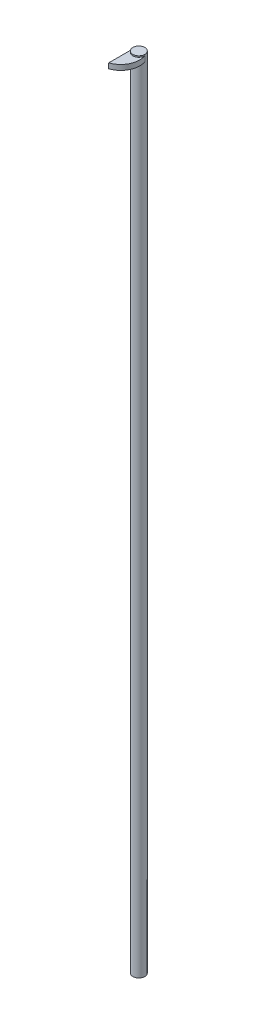
ISO-10303-21;
HEADER;
FILE_DESCRIPTION(('STEP AP214'),'2;1');
FILE_NAME('part.step','',(''),(''),'','','');
FILE_SCHEMA(('AUTOMOTIVE_DESIGN { 1 0 10303 214 1 1 1 1 }'));
ENDSEC;
DATA;
#1=APPLICATION_CONTEXT('core data for automotive mechanical design processes');
#2=APPLICATION_PROTOCOL_DEFINITION('international standard','automotive_design',2000,#1);
#3=PRODUCT_CONTEXT('',#1,'mechanical');
#4=PRODUCT('Part','Part','',(#3));
#5=PRODUCT_RELATED_PRODUCT_CATEGORY('part','',(#4));
#6=PRODUCT_DEFINITION_FORMATION('','',#4);
#7=PRODUCT_DEFINITION_CONTEXT('part definition',#1,'design');
#8=PRODUCT_DEFINITION('design','',#6,#7);
#9=PRODUCT_DEFINITION_SHAPE('','',#8);
#10=(LENGTH_UNIT() NAMED_UNIT(*) SI_UNIT(.MILLI.,.METRE.));
#11=(NAMED_UNIT(*) PLANE_ANGLE_UNIT() SI_UNIT($,.RADIAN.));
#12=(NAMED_UNIT(*) SI_UNIT($,.STERADIAN.) SOLID_ANGLE_UNIT());
#13=UNCERTAINTY_MEASURE_WITH_UNIT(LENGTH_MEASURE(1.E-05),#10,'distance_accuracy_value','');
#14=(GEOMETRIC_REPRESENTATION_CONTEXT(3) GLOBAL_UNCERTAINTY_ASSIGNED_CONTEXT((#13)) GLOBAL_UNIT_ASSIGNED_CONTEXT((#10,
#11,#12)) REPRESENTATION_CONTEXT('',''));
#15=CARTESIAN_POINT('',(0.,0.,0.));
#16=DIRECTION('',(0.,0.,1.));
#17=DIRECTION('',(1.,0.,0.));
#18=AXIS2_PLACEMENT_3D('',#15,#16,#17);
#19=CARTESIAN_POINT('',(838.898443773794,3953.07725580716,1523.82012251056));
#20=DIRECTION('',(0.,1.,0.));
#21=DIRECTION('',(0.,0.,1.));
#22=AXIS2_PLACEMENT_3D('',#19,#20,#21);
#23=CYLINDRICAL_SURFACE('',#22,9.31366205789831);
#24=CARTESIAN_POINT('',(838.898443773794,3953.07725580716,1523.82012251056));
#25=DIRECTION('',(0.,1.,0.));
#26=DIRECTION('',(0.,0.,1.));
#27=AXIS2_PLACEMENT_3D('',#24,#25,#26);
#28=CIRCLE('',#27,9.31366205789831);
#29=CARTESIAN_POINT('',(838.898443773794,3953.07725580716,1533.13378456846));
#30=VERTEX_POINT('',#29);
#31=EDGE_CURVE('E75',#30,#30,#28,.T.);
#32=ORIENTED_EDGE('',*,*,#31,.T.);
#33=EDGE_LOOP('',(#32));
#34=FACE_BOUND('',#33,.T.);
#35=CARTESIAN_POINT('',(838.898443773794,5189.07725580715,1523.82012251056));
#36=DIRECTION('',(0.,1.,0.));
#37=DIRECTION('',(0.,0.,1.));
#38=AXIS2_PLACEMENT_3D('',#35,#36,#37);
#39=CIRCLE('',#38,9.31366205789831);
#40=CARTESIAN_POINT('',(838.898443773794,5189.07725580715,1533.13378456846));
#41=VERTEX_POINT('',#40);
#42=EDGE_CURVE('E66',#41,#41,#39,.T.);
#43=ORIENTED_EDGE('',*,*,#42,.F.);
#44=EDGE_LOOP('',(#43));
#45=FACE_BOUND('',#44,.T.);
#46=DIRECTION('',(0.,-1.,0.));
#47=VECTOR('',#46,1.);
#48=CARTESIAN_POINT('',(829.584781715896,5187.07725580716,1523.82012251056));
#49=LINE('',#48,#47);
#50=CARTESIAN_POINT('',(829.584781715896,5187.07725580716,1523.82012251056));
#51=VERTEX_POINT('',#50);
#52=CARTESIAN_POINT('',(829.584781715896,5179.07725580716,1523.82012251056));
#53=VERTEX_POINT('',#52);
#54=EDGE_CURVE('E50',#51,#53,#49,.T.);
#55=ORIENTED_EDGE('',*,*,#54,.F.);
#56=CARTESIAN_POINT('',(838.898443773794,5187.07725580716,1523.82012251056));
#57=DIRECTION('',(0.,-1.,0.));
#58=DIRECTION('',(0.,0.,-1.));
#59=AXIS2_PLACEMENT_3D('',#56,#57,#58);
#60=CIRCLE('',#59,9.31366205789831);
#61=CARTESIAN_POINT('',(848.212105831693,5187.07725580716,1523.82012251056));
#62=VERTEX_POINT('',#61);
#63=EDGE_CURVE('E11',#51,#62,#60,.F.);
#64=ORIENTED_EDGE('',*,*,#63,.T.);
#65=DIRECTION('',(0.,-1.,0.));
#66=VECTOR('',#65,1.);
#67=CARTESIAN_POINT('',(848.212105831693,5187.07725580716,1523.82012251056));
#68=LINE('',#67,#66);
#69=CARTESIAN_POINT('',(848.212105831693,5179.07725580716,1523.82012251056));
#70=VERTEX_POINT('',#69);
#71=EDGE_CURVE('E61',#62,#70,#68,.T.);
#72=ORIENTED_EDGE('',*,*,#71,.T.);
#73=CARTESIAN_POINT('',(838.898443773794,5179.07725580716,1523.82012251056));
#74=DIRECTION('',(0.,-1.,0.));
#75=DIRECTION('',(0.,0.,-1.));
#76=AXIS2_PLACEMENT_3D('',#73,#74,#75);
#77=CIRCLE('',#76,9.31366205789831);
#78=EDGE_CURVE('E40',#53,#70,#77,.F.);
#79=ORIENTED_EDGE('',*,*,#78,.F.);
#80=EDGE_LOOP('',(#55,#64,#72,#79));
#81=FACE_BOUND('',#80,.T.);
#82=ADVANCED_FACE('F33',(#34,#45,#81),#23,.T.);
#83=CARTESIAN_POINT('',(838.898443773794,3953.07725580716,1523.82012251056));
#84=DIRECTION('',(0.,1.,0.));
#85=DIRECTION('',(0.,0.,1.));
#86=AXIS2_PLACEMENT_3D('',#83,#84,#85);
#87=PLANE('',#86);
#88=ORIENTED_EDGE('',*,*,#31,.F.);
#89=EDGE_LOOP('',(#88));
#90=FACE_BOUND('',#89,.T.);
#91=ADVANCED_FACE('F95',(#90),#87,.F.);
#92=CARTESIAN_POINT('',(838.898443773794,5189.07725580715,1523.82012251056));
#93=DIRECTION('',(0.,1.,0.));
#94=DIRECTION('',(0.,0.,1.));
#95=AXIS2_PLACEMENT_3D('',#92,#93,#94);
#96=PLANE('',#95);
#97=ORIENTED_EDGE('',*,*,#42,.T.);
#98=EDGE_LOOP('',(#97));
#99=FACE_BOUND('',#98,.T.);
#100=ADVANCED_FACE('F97',(#99),#96,.T.);
#101=CARTESIAN_POINT('',(820.235982645078,5187.07725580716,1533.16892158138));
#102=DIRECTION('',(0.,-1.,0.));
#103=DIRECTION('',(0.,0.,-1.));
#104=AXIS2_PLACEMENT_3D('',#101,#102,#103);
#105=CYLINDRICAL_SURFACE('',#104,29.4968390275833);
#106=DIRECTION('',(0.,-1.,0.));
#107=VECTOR('',#106,1.);
#108=CARTESIAN_POINT('',(829.584781715896,5187.07725580716,1561.145044768));
#109=LINE('',#108,#107);
#110=CARTESIAN_POINT('',(829.584781715896,5187.07725580716,1561.145044768));
#111=VERTEX_POINT('',#110);
#112=CARTESIAN_POINT('',(829.584781715896,5179.07725580716,1561.145044768));
#113=VERTEX_POINT('',#112);
#114=EDGE_CURVE('E78',#111,#113,#109,.T.);
#115=ORIENTED_EDGE('',*,*,#114,.T.);
#116=CARTESIAN_POINT('',(820.235982645078,5179.07725580716,1533.16892158138));
#117=DIRECTION('',(0.,1.,0.));
#118=DIRECTION('',(0.,0.,-1.));
#119=AXIS2_PLACEMENT_3D('',#116,#117,#118);
#120=CIRCLE('',#119,29.4968390275833);
#121=EDGE_CURVE('E72',#113,#70,#120,.T.);
#122=ORIENTED_EDGE('',*,*,#121,.T.);
#123=ORIENTED_EDGE('',*,*,#71,.F.);
#124=CARTESIAN_POINT('',(820.235982645078,5187.07725580716,1533.16892158138));
#125=DIRECTION('',(0.,1.,0.));
#126=DIRECTION('',(0.,0.,-1.));
#127=AXIS2_PLACEMENT_3D('',#124,#125,#126);
#128=CIRCLE('',#127,29.4968390275833);
#129=EDGE_CURVE('E80',#111,#62,#128,.T.);
#130=ORIENTED_EDGE('',*,*,#129,.F.);
#131=EDGE_LOOP('',(#115,#122,#123,#130));
#132=FACE_BOUND('',#131,.T.);
#133=ADVANCED_FACE('F76',(#132),#105,.T.);
#134=CARTESIAN_POINT('',(829.584781715896,5187.07725580716,1561.145044768));
#135=DIRECTION('',(1.,0.,0.));
#136=DIRECTION('',(0.,0.,-1.));
#137=AXIS2_PLACEMENT_3D('',#134,#135,#136);
#138=PLANE('',#137);
#139=ORIENTED_EDGE('',*,*,#54,.T.);
#140=DIRECTION('',(0.,0.,1.));
#141=VECTOR('',#140,1.);
#142=CARTESIAN_POINT('',(829.584781715896,5179.07725580716,1561.145044768));
#143=LINE('',#142,#141);
#144=EDGE_CURVE('E74',#53,#113,#143,.T.);
#145=ORIENTED_EDGE('',*,*,#144,.T.);
#146=ORIENTED_EDGE('',*,*,#114,.F.);
#147=DIRECTION('',(0.,0.,1.));
#148=VECTOR('',#147,1.);
#149=CARTESIAN_POINT('',(829.584781715896,5187.07725580716,1561.145044768));
#150=LINE('',#149,#148);
#151=EDGE_CURVE('E84',#51,#111,#150,.T.);
#152=ORIENTED_EDGE('',*,*,#151,.F.);
#153=EDGE_LOOP('',(#139,#145,#146,#152));
#154=FACE_BOUND('',#153,.T.);
#155=ADVANCED_FACE('F107',(#154),#138,.F.);
#156=CARTESIAN_POINT('',(820.235982645078,5187.07725580716,1533.16892158138));
#157=DIRECTION('',(0.,-1.,0.));
#158=DIRECTION('',(0.,0.,-1.));
#159=AXIS2_PLACEMENT_3D('',#156,#157,#158);
#160=PLANE('',#159);
#161=ORIENTED_EDGE('',*,*,#63,.F.);
#162=ORIENTED_EDGE('',*,*,#151,.T.);
#163=ORIENTED_EDGE('',*,*,#129,.T.);
#164=EDGE_LOOP('',(#161,#162,#163));
#165=FACE_BOUND('',#164,.T.);
#166=ADVANCED_FACE('F110',(#165),#160,.F.);
#167=CARTESIAN_POINT('',(820.235982645078,5179.07725580716,1533.16892158138));
#168=DIRECTION('',(0.,-1.,0.));
#169=DIRECTION('',(0.,0.,-1.));
#170=AXIS2_PLACEMENT_3D('',#167,#168,#169);
#171=PLANE('',#170);
#172=ORIENTED_EDGE('',*,*,#144,.F.);
#173=ORIENTED_EDGE('',*,*,#78,.T.);
#174=ORIENTED_EDGE('',*,*,#121,.F.);
#175=EDGE_LOOP('',(#172,#173,#174));
#176=FACE_BOUND('',#175,.T.);
#177=ADVANCED_FACE('F71',(#176),#171,.T.);
#178=CLOSED_SHELL('',(#82,#91,#100,#133,#155,#166,#177));
#179=MANIFOLD_SOLID_BREP('B2',#178);
#180=ADVANCED_BREP_SHAPE_REPRESENTATION('',(#18,#179),#14);
#181=SHAPE_DEFINITION_REPRESENTATION(#9,#180);
ENDSEC;
END-ISO-10303-21;
